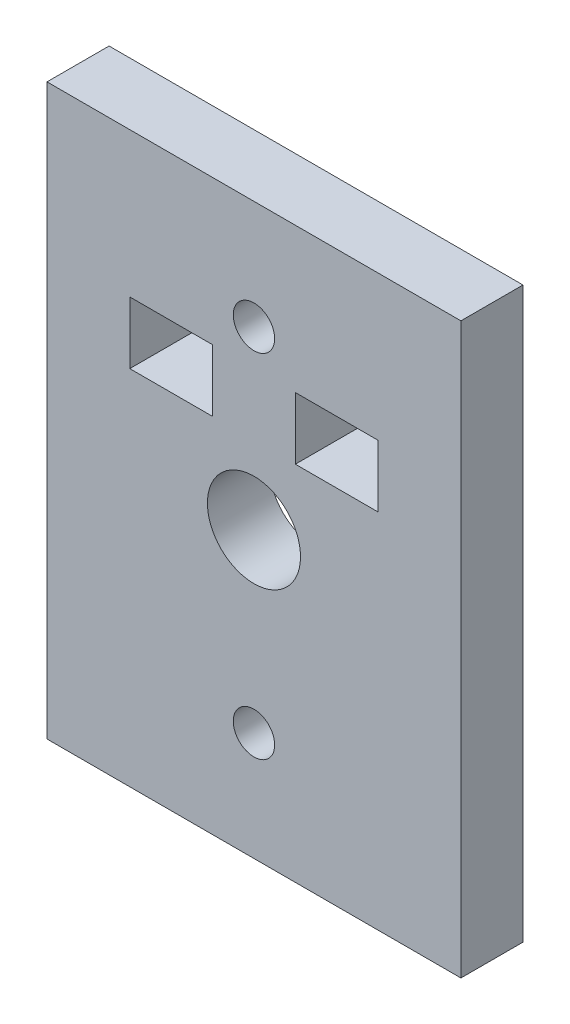
ISO-10303-21;
HEADER;
FILE_DESCRIPTION(('STEP AP214'),'2;1');
FILE_NAME('part.step','',(''),(''),'','','');
FILE_SCHEMA(('AUTOMOTIVE_DESIGN { 1 0 10303 214 1 1 1 1 }'));
ENDSEC;
DATA;
#1=APPLICATION_CONTEXT('core data for automotive mechanical design processes');
#2=APPLICATION_PROTOCOL_DEFINITION('international standard','automotive_design',2000,#1);
#3=PRODUCT_CONTEXT('',#1,'mechanical');
#4=PRODUCT('Part','Part','',(#3));
#5=PRODUCT_RELATED_PRODUCT_CATEGORY('part','',(#4));
#6=PRODUCT_DEFINITION_FORMATION('','',#4);
#7=PRODUCT_DEFINITION_CONTEXT('part definition',#1,'design');
#8=PRODUCT_DEFINITION('design','',#6,#7);
#9=PRODUCT_DEFINITION_SHAPE('','',#8);
#10=(LENGTH_UNIT() NAMED_UNIT(*) SI_UNIT(.MILLI.,.METRE.));
#11=(NAMED_UNIT(*) PLANE_ANGLE_UNIT() SI_UNIT($,.RADIAN.));
#12=(NAMED_UNIT(*) SI_UNIT($,.STERADIAN.) SOLID_ANGLE_UNIT());
#13=UNCERTAINTY_MEASURE_WITH_UNIT(LENGTH_MEASURE(1.E-05),#10,'distance_accuracy_value','');
#14=(GEOMETRIC_REPRESENTATION_CONTEXT(3) GLOBAL_UNCERTAINTY_ASSIGNED_CONTEXT((#13)) GLOBAL_UNIT_ASSIGNED_CONTEXT((#10,
#11,#12)) REPRESENTATION_CONTEXT('',''));
#15=CARTESIAN_POINT('',(0.,0.,0.));
#16=DIRECTION('',(0.,0.,1.));
#17=DIRECTION('',(1.,0.,0.));
#18=AXIS2_PLACEMENT_3D('',#15,#16,#17);
#19=CARTESIAN_POINT('',(6.,0.,3.));
#20=DIRECTION('',(-1.,0.,0.));
#21=DIRECTION('',(0.,0.,1.));
#22=AXIS2_PLACEMENT_3D('',#19,#20,#21);
#23=PLANE('',#22);
#24=DIRECTION('',(0.,1.,0.));
#25=VECTOR('',#24,1.);
#26=CARTESIAN_POINT('',(6.,0.,0.));
#27=LINE('',#26,#25);
#28=CARTESIAN_POINT('',(6.,3.75,0.));
#29=VERTEX_POINT('',#28);
#30=CARTESIAN_POINT('',(6.,6.75,0.));
#31=VERTEX_POINT('',#30);
#32=EDGE_CURVE('E215',#29,#31,#27,.T.);
#33=ORIENTED_EDGE('',*,*,#32,.F.);
#34=DIRECTION('',(0.,0.,-1.));
#35=VECTOR('',#34,1.);
#36=CARTESIAN_POINT('',(6.,3.75,3.));
#37=LINE('',#36,#35);
#38=CARTESIAN_POINT('',(6.,3.75,3.));
#39=VERTEX_POINT('',#38);
#40=EDGE_CURVE('E11',#39,#29,#37,.T.);
#41=ORIENTED_EDGE('',*,*,#40,.F.);
#42=DIRECTION('',(0.,1.,0.));
#43=VECTOR('',#42,1.);
#44=CARTESIAN_POINT('',(6.,0.,3.));
#45=LINE('',#44,#43);
#46=CARTESIAN_POINT('',(6.,6.75,3.));
#47=VERTEX_POINT('',#46);
#48=EDGE_CURVE('E154',#39,#47,#45,.T.);
#49=ORIENTED_EDGE('',*,*,#48,.T.);
#50=DIRECTION('',(0.,0.,-1.));
#51=VECTOR('',#50,1.);
#52=CARTESIAN_POINT('',(6.,6.75,3.));
#53=LINE('',#52,#51);
#54=EDGE_CURVE('E62',#47,#31,#53,.T.);
#55=ORIENTED_EDGE('',*,*,#54,.T.);
#56=EDGE_LOOP('',(#33,#41,#49,#55));
#57=FACE_BOUND('',#56,.T.);
#58=ADVANCED_FACE('F43',(#57),#23,.T.);
#59=CARTESIAN_POINT('',(0.,3.75,3.));
#60=DIRECTION('',(0.,-1.,0.));
#61=DIRECTION('',(0.,0.,-1.));
#62=AXIS2_PLACEMENT_3D('',#59,#60,#61);
#63=PLANE('',#62);
#64=DIRECTION('',(-1.,0.,0.));
#65=VECTOR('',#64,1.);
#66=CARTESIAN_POINT('',(0.,3.75,0.));
#67=LINE('',#66,#65);
#68=CARTESIAN_POINT('',(2.,3.75,0.));
#69=VERTEX_POINT('',#68);
#70=EDGE_CURVE('E159',#29,#69,#67,.T.);
#71=ORIENTED_EDGE('',*,*,#70,.T.);
#72=DIRECTION('',(0.,0.,-1.));
#73=VECTOR('',#72,1.);
#74=CARTESIAN_POINT('',(2.,3.75,3.));
#75=LINE('',#74,#73);
#76=CARTESIAN_POINT('',(2.,3.75,3.));
#77=VERTEX_POINT('',#76);
#78=EDGE_CURVE('E53',#77,#69,#75,.T.);
#79=ORIENTED_EDGE('',*,*,#78,.F.);
#80=DIRECTION('',(-1.,0.,0.));
#81=VECTOR('',#80,1.);
#82=CARTESIAN_POINT('',(0.,3.75,3.));
#83=LINE('',#82,#81);
#84=EDGE_CURVE('E148',#39,#77,#83,.T.);
#85=ORIENTED_EDGE('',*,*,#84,.F.);
#86=ORIENTED_EDGE('',*,*,#40,.T.);
#87=EDGE_LOOP('',(#71,#79,#85,#86));
#88=FACE_BOUND('',#87,.T.);
#89=ADVANCED_FACE('F157',(#88),#63,.F.);
#90=CARTESIAN_POINT('',(2.,0.,3.));
#91=DIRECTION('',(-1.,0.,0.));
#92=DIRECTION('',(0.,0.,1.));
#93=AXIS2_PLACEMENT_3D('',#90,#91,#92);
#94=PLANE('',#93);
#95=DIRECTION('',(0.,1.,0.));
#96=VECTOR('',#95,1.);
#97=CARTESIAN_POINT('',(2.,0.,0.));
#98=LINE('',#97,#96);
#99=CARTESIAN_POINT('',(2.,6.75,0.));
#100=VERTEX_POINT('',#99);
#101=EDGE_CURVE('E218',#69,#100,#98,.T.);
#102=ORIENTED_EDGE('',*,*,#101,.T.);
#103=DIRECTION('',(0.,0.,-1.));
#104=VECTOR('',#103,1.);
#105=CARTESIAN_POINT('',(2.,6.75,3.));
#106=LINE('',#105,#104);
#107=CARTESIAN_POINT('',(2.,6.75,3.));
#108=VERTEX_POINT('',#107);
#109=EDGE_CURVE('E100',#108,#100,#106,.T.);
#110=ORIENTED_EDGE('',*,*,#109,.F.);
#111=DIRECTION('',(0.,1.,0.));
#112=VECTOR('',#111,1.);
#113=CARTESIAN_POINT('',(2.,0.,3.));
#114=LINE('',#113,#112);
#115=EDGE_CURVE('E140',#77,#108,#114,.T.);
#116=ORIENTED_EDGE('',*,*,#115,.F.);
#117=ORIENTED_EDGE('',*,*,#78,.T.);
#118=EDGE_LOOP('',(#102,#110,#116,#117));
#119=FACE_BOUND('',#118,.T.);
#120=ADVANCED_FACE('F142',(#119),#94,.F.);
#121=CARTESIAN_POINT('',(-2.,0.,3.));
#122=DIRECTION('',(-1.,0.,0.));
#123=DIRECTION('',(0.,0.,1.));
#124=AXIS2_PLACEMENT_3D('',#121,#122,#123);
#125=PLANE('',#124);
#126=DIRECTION('',(0.,1.,0.));
#127=VECTOR('',#126,1.);
#128=CARTESIAN_POINT('',(-2.,0.,0.));
#129=LINE('',#128,#127);
#130=CARTESIAN_POINT('',(-2.,3.75,0.));
#131=VERTEX_POINT('',#130);
#132=CARTESIAN_POINT('',(-2.,6.75,0.));
#133=VERTEX_POINT('',#132);
#134=EDGE_CURVE('E203',#131,#133,#129,.T.);
#135=ORIENTED_EDGE('',*,*,#134,.F.);
#136=DIRECTION('',(0.,0.,-1.));
#137=VECTOR('',#136,1.);
#138=CARTESIAN_POINT('',(-2.,3.75,3.));
#139=LINE('',#138,#137);
#140=CARTESIAN_POINT('',(-2.,3.75,3.));
#141=VERTEX_POINT('',#140);
#142=EDGE_CURVE('E171',#141,#131,#139,.T.);
#143=ORIENTED_EDGE('',*,*,#142,.F.);
#144=DIRECTION('',(0.,1.,0.));
#145=VECTOR('',#144,1.);
#146=CARTESIAN_POINT('',(-2.,0.,3.));
#147=LINE('',#146,#145);
#148=CARTESIAN_POINT('',(-2.,6.75,3.));
#149=VERTEX_POINT('',#148);
#150=EDGE_CURVE('E244',#141,#149,#147,.T.);
#151=ORIENTED_EDGE('',*,*,#150,.T.);
#152=DIRECTION('',(0.,0.,-1.));
#153=VECTOR('',#152,1.);
#154=CARTESIAN_POINT('',(-2.,6.75,3.));
#155=LINE('',#154,#153);
#156=EDGE_CURVE('E164',#149,#133,#155,.T.);
#157=ORIENTED_EDGE('',*,*,#156,.T.);
#158=EDGE_LOOP('',(#135,#143,#151,#157));
#159=FACE_BOUND('',#158,.T.);
#160=ADVANCED_FACE('F301',(#159),#125,.T.);
#161=CARTESIAN_POINT('',(0.,3.75,3.));
#162=DIRECTION('',(0.,1.,0.));
#163=DIRECTION('',(0.,0.,1.));
#164=AXIS2_PLACEMENT_3D('',#161,#162,#163);
#165=PLANE('',#164);
#166=DIRECTION('',(1.,0.,0.));
#167=VECTOR('',#166,1.);
#168=CARTESIAN_POINT('',(0.,3.75,0.));
#169=LINE('',#168,#167);
#170=CARTESIAN_POINT('',(-6.,3.75,0.));
#171=VERTEX_POINT('',#170);
#172=EDGE_CURVE('E206',#171,#131,#169,.T.);
#173=ORIENTED_EDGE('',*,*,#172,.F.);
#174=DIRECTION('',(0.,0.,-1.));
#175=VECTOR('',#174,1.);
#176=CARTESIAN_POINT('',(-6.,3.75,3.));
#177=LINE('',#176,#175);
#178=CARTESIAN_POINT('',(-6.,3.75,3.));
#179=VERTEX_POINT('',#178);
#180=EDGE_CURVE('E169',#179,#171,#177,.T.);
#181=ORIENTED_EDGE('',*,*,#180,.F.);
#182=DIRECTION('',(1.,0.,0.));
#183=VECTOR('',#182,1.);
#184=CARTESIAN_POINT('',(0.,3.75,3.));
#185=LINE('',#184,#183);
#186=EDGE_CURVE('E247',#179,#141,#185,.T.);
#187=ORIENTED_EDGE('',*,*,#186,.T.);
#188=ORIENTED_EDGE('',*,*,#142,.T.);
#189=EDGE_LOOP('',(#173,#181,#187,#188));
#190=FACE_BOUND('',#189,.T.);
#191=ADVANCED_FACE('F297',(#190),#165,.T.);
#192=CARTESIAN_POINT('',(-6.,0.,3.));
#193=DIRECTION('',(-1.,0.,0.));
#194=DIRECTION('',(0.,0.,1.));
#195=AXIS2_PLACEMENT_3D('',#192,#193,#194);
#196=PLANE('',#195);
#197=DIRECTION('',(0.,1.,0.));
#198=VECTOR('',#197,1.);
#199=CARTESIAN_POINT('',(-6.,0.,0.));
#200=LINE('',#199,#198);
#201=CARTESIAN_POINT('',(-6.,6.75,0.));
#202=VERTEX_POINT('',#201);
#203=EDGE_CURVE('E209',#171,#202,#200,.T.);
#204=ORIENTED_EDGE('',*,*,#203,.T.);
#205=DIRECTION('',(0.,0.,-1.));
#206=VECTOR('',#205,1.);
#207=CARTESIAN_POINT('',(-6.,6.75,3.));
#208=LINE('',#207,#206);
#209=CARTESIAN_POINT('',(-6.,6.75,3.));
#210=VERTEX_POINT('',#209);
#211=EDGE_CURVE('E166',#210,#202,#208,.T.);
#212=ORIENTED_EDGE('',*,*,#211,.F.);
#213=DIRECTION('',(0.,1.,0.));
#214=VECTOR('',#213,1.);
#215=CARTESIAN_POINT('',(-6.,0.,3.));
#216=LINE('',#215,#214);
#217=EDGE_CURVE('E250',#179,#210,#216,.T.);
#218=ORIENTED_EDGE('',*,*,#217,.F.);
#219=ORIENTED_EDGE('',*,*,#180,.T.);
#220=EDGE_LOOP('',(#204,#212,#218,#219));
#221=FACE_BOUND('',#220,.T.);
#222=ADVANCED_FACE('F294',(#221),#196,.F.);
#223=CARTESIAN_POINT('',(0.,-13.75,3.));
#224=DIRECTION('',(0.,1.,0.));
#225=DIRECTION('',(-1.,0.,0.));
#226=AXIS2_PLACEMENT_3D('',#223,#224,#225);
#227=PLANE('',#226);
#228=DIRECTION('',(1.,0.,0.));
#229=VECTOR('',#228,1.);
#230=CARTESIAN_POINT('',(0.,-13.75,0.));
#231=LINE('',#230,#229);
#232=CARTESIAN_POINT('',(-10.,-13.75,0.));
#233=VERTEX_POINT('',#232);
#234=CARTESIAN_POINT('',(10.,-13.75,0.));
#235=VERTEX_POINT('',#234);
#236=EDGE_CURVE('E190',#233,#235,#231,.T.);
#237=ORIENTED_EDGE('',*,*,#236,.T.);
#238=DIRECTION('',(0.,0.,-1.));
#239=VECTOR('',#238,1.);
#240=CARTESIAN_POINT('',(10.,-13.75,3.));
#241=LINE('',#240,#239);
#242=CARTESIAN_POINT('',(10.,-13.75,3.));
#243=VERTEX_POINT('',#242);
#244=EDGE_CURVE('E47',#243,#235,#241,.T.);
#245=ORIENTED_EDGE('',*,*,#244,.F.);
#246=DIRECTION('',(1.,0.,0.));
#247=VECTOR('',#246,1.);
#248=CARTESIAN_POINT('',(0.,-13.75,3.));
#249=LINE('',#248,#247);
#250=CARTESIAN_POINT('',(-10.,-13.75,3.));
#251=VERTEX_POINT('',#250);
#252=EDGE_CURVE('E231',#251,#243,#249,.T.);
#253=ORIENTED_EDGE('',*,*,#252,.F.);
#254=DIRECTION('',(0.,0.,-1.));
#255=VECTOR('',#254,1.);
#256=CARTESIAN_POINT('',(-10.,-13.75,3.));
#257=LINE('',#256,#255);
#258=EDGE_CURVE('E173',#251,#233,#257,.T.);
#259=ORIENTED_EDGE('',*,*,#258,.T.);
#260=EDGE_LOOP('',(#237,#245,#253,#259));
#261=FACE_BOUND('',#260,.T.);
#262=ADVANCED_FACE('F45',(#261),#227,.F.);
#263=CARTESIAN_POINT('',(10.,0.,3.));
#264=DIRECTION('',(-1.,0.,0.));
#265=DIRECTION('',(0.,0.,1.));
#266=AXIS2_PLACEMENT_3D('',#263,#264,#265);
#267=PLANE('',#266);
#268=DIRECTION('',(0.,1.,0.));
#269=VECTOR('',#268,1.);
#270=CARTESIAN_POINT('',(10.,0.,0.));
#271=LINE('',#270,#269);
#272=CARTESIAN_POINT('',(10.,13.75,0.));
#273=VERTEX_POINT('',#272);
#274=EDGE_CURVE('E185',#235,#273,#271,.T.);
#275=ORIENTED_EDGE('',*,*,#274,.T.);
#276=DIRECTION('',(0.,0.,-1.));
#277=VECTOR('',#276,1.);
#278=CARTESIAN_POINT('',(10.,13.75,3.));
#279=LINE('',#278,#277);
#280=CARTESIAN_POINT('',(10.,13.75,3.));
#281=VERTEX_POINT('',#280);
#282=EDGE_CURVE('E177',#281,#273,#279,.T.);
#283=ORIENTED_EDGE('',*,*,#282,.F.);
#284=DIRECTION('',(0.,1.,0.));
#285=VECTOR('',#284,1.);
#286=CARTESIAN_POINT('',(10.,0.,3.));
#287=LINE('',#286,#285);
#288=EDGE_CURVE('E113',#243,#281,#287,.T.);
#289=ORIENTED_EDGE('',*,*,#288,.F.);
#290=ORIENTED_EDGE('',*,*,#244,.T.);
#291=EDGE_LOOP('',(#275,#283,#289,#290));
#292=FACE_BOUND('',#291,.T.);
#293=ADVANCED_FACE('F184',(#292),#267,.F.);
#294=CARTESIAN_POINT('',(0.,13.75,3.));
#295=DIRECTION('',(0.,1.,0.));
#296=DIRECTION('',(0.,0.,1.));
#297=AXIS2_PLACEMENT_3D('',#294,#295,#296);
#298=PLANE('',#297);
#299=DIRECTION('',(1.,0.,0.));
#300=VECTOR('',#299,1.);
#301=CARTESIAN_POINT('',(0.,13.75,0.));
#302=LINE('',#301,#300);
#303=CARTESIAN_POINT('',(-10.,13.75,0.));
#304=VERTEX_POINT('',#303);
#305=EDGE_CURVE('E195',#304,#273,#302,.T.);
#306=ORIENTED_EDGE('',*,*,#305,.F.);
#307=DIRECTION('',(0.,0.,-1.));
#308=VECTOR('',#307,1.);
#309=CARTESIAN_POINT('',(-10.,13.75,3.));
#310=LINE('',#309,#308);
#311=CARTESIAN_POINT('',(-10.,13.75,3.));
#312=VERTEX_POINT('',#311);
#313=EDGE_CURVE('E175',#312,#304,#310,.T.);
#314=ORIENTED_EDGE('',*,*,#313,.F.);
#315=DIRECTION('',(1.,0.,0.));
#316=VECTOR('',#315,1.);
#317=CARTESIAN_POINT('',(0.,13.75,3.));
#318=LINE('',#317,#316);
#319=EDGE_CURVE('E237',#312,#281,#318,.T.);
#320=ORIENTED_EDGE('',*,*,#319,.T.);
#321=ORIENTED_EDGE('',*,*,#282,.T.);
#322=EDGE_LOOP('',(#306,#314,#320,#321));
#323=FACE_BOUND('',#322,.T.);
#324=ADVANCED_FACE('F306',(#323),#298,.T.);
#325=CARTESIAN_POINT('',(0.,8.5,3.));
#326=DIRECTION('',(0.,0.,-1.));
#327=DIRECTION('',(-1.,0.,0.));
#328=AXIS2_PLACEMENT_3D('',#325,#326,#327);
#329=CYLINDRICAL_SURFACE('',#328,1.);
#330=CARTESIAN_POINT('',(0.,8.5,3.));
#331=DIRECTION('',(0.,0.,1.));
#332=DIRECTION('',(1.,0.,0.));
#333=AXIS2_PLACEMENT_3D('',#330,#331,#332);
#334=CIRCLE('',#333,1.);
#335=CARTESIAN_POINT('',(1.,8.5,3.));
#336=VERTEX_POINT('',#335);
#337=EDGE_CURVE('E259',#336,#336,#334,.T.);
#338=ORIENTED_EDGE('',*,*,#337,.T.);
#339=EDGE_LOOP('',(#338));
#340=FACE_BOUND('',#339,.T.);
#341=CARTESIAN_POINT('',(0.,8.5,0.));
#342=DIRECTION('',(0.,0.,1.));
#343=DIRECTION('',(1.,0.,0.));
#344=AXIS2_PLACEMENT_3D('',#341,#342,#343);
#345=CIRCLE('',#344,1.);
#346=CARTESIAN_POINT('',(1.,8.5,0.));
#347=VERTEX_POINT('',#346);
#348=EDGE_CURVE('E226',#347,#347,#345,.T.);
#349=ORIENTED_EDGE('',*,*,#348,.F.);
#350=EDGE_LOOP('',(#349));
#351=FACE_BOUND('',#350,.T.);
#352=ADVANCED_FACE('F308',(#340,#351),#329,.F.);
#353=CARTESIAN_POINT('',(0.,0.,3.));
#354=DIRECTION('',(0.,0.,-1.));
#355=DIRECTION('',(-1.,0.,0.));
#356=AXIS2_PLACEMENT_3D('',#353,#354,#355);
#357=CYLINDRICAL_SURFACE('',#356,2.25);
#358=CARTESIAN_POINT('',(0.,0.,3.));
#359=DIRECTION('',(0.,0.,1.));
#360=DIRECTION('',(1.,0.,0.));
#361=AXIS2_PLACEMENT_3D('',#358,#359,#360);
#362=CIRCLE('',#361,2.25);
#363=CARTESIAN_POINT('',(2.25,0.,3.));
#364=VERTEX_POINT('',#363);
#365=EDGE_CURVE('E257',#364,#364,#362,.T.);
#366=ORIENTED_EDGE('',*,*,#365,.T.);
#367=EDGE_LOOP('',(#366));
#368=FACE_BOUND('',#367,.T.);
#369=CARTESIAN_POINT('',(0.,0.,0.));
#370=DIRECTION('',(0.,0.,1.));
#371=DIRECTION('',(1.,0.,0.));
#372=AXIS2_PLACEMENT_3D('',#369,#370,#371);
#373=CIRCLE('',#372,2.25);
#374=CARTESIAN_POINT('',(2.25,0.,0.));
#375=VERTEX_POINT('',#374);
#376=EDGE_CURVE('E223',#375,#375,#373,.T.);
#377=ORIENTED_EDGE('',*,*,#376,.F.);
#378=EDGE_LOOP('',(#377));
#379=FACE_BOUND('',#378,.T.);
#380=ADVANCED_FACE('F384',(#368,#379),#357,.F.);
#381=CARTESIAN_POINT('',(0.,6.75,3.));
#382=DIRECTION('',(0.,-1.,0.));
#383=DIRECTION('',(0.,0.,-1.));
#384=AXIS2_PLACEMENT_3D('',#381,#382,#383);
#385=PLANE('',#384);
#386=DIRECTION('',(-1.,0.,0.));
#387=VECTOR('',#386,1.);
#388=CARTESIAN_POINT('',(0.,6.75,0.));
#389=LINE('',#388,#387);
#390=EDGE_CURVE('E220',#31,#100,#389,.T.);
#391=ORIENTED_EDGE('',*,*,#390,.F.);
#392=ORIENTED_EDGE('',*,*,#54,.F.);
#393=DIRECTION('',(-1.,0.,0.));
#394=VECTOR('',#393,1.);
#395=CARTESIAN_POINT('',(0.,6.75,3.));
#396=LINE('',#395,#394);
#397=EDGE_CURVE('E147',#47,#108,#396,.T.);
#398=ORIENTED_EDGE('',*,*,#397,.T.);
#399=ORIENTED_EDGE('',*,*,#109,.T.);
#400=EDGE_LOOP('',(#391,#392,#398,#399));
#401=FACE_BOUND('',#400,.T.);
#402=ADVANCED_FACE('F292',(#401),#385,.T.);
#403=CARTESIAN_POINT('',(0.,6.75,3.));
#404=DIRECTION('',(0.,1.,0.));
#405=DIRECTION('',(0.,0.,1.));
#406=AXIS2_PLACEMENT_3D('',#403,#404,#405);
#407=PLANE('',#406);
#408=DIRECTION('',(1.,0.,0.));
#409=VECTOR('',#408,1.);
#410=CARTESIAN_POINT('',(0.,6.75,0.));
#411=LINE('',#410,#409);
#412=EDGE_CURVE('E212',#202,#133,#411,.T.);
#413=ORIENTED_EDGE('',*,*,#412,.T.);
#414=ORIENTED_EDGE('',*,*,#156,.F.);
#415=DIRECTION('',(1.,0.,0.));
#416=VECTOR('',#415,1.);
#417=CARTESIAN_POINT('',(0.,6.75,3.));
#418=LINE('',#417,#416);
#419=EDGE_CURVE('E253',#210,#149,#418,.T.);
#420=ORIENTED_EDGE('',*,*,#419,.F.);
#421=ORIENTED_EDGE('',*,*,#211,.T.);
#422=EDGE_LOOP('',(#413,#414,#420,#421));
#423=FACE_BOUND('',#422,.T.);
#424=ADVANCED_FACE('F277',(#423),#407,.F.);
#425=CARTESIAN_POINT('',(-10.,0.,3.));
#426=DIRECTION('',(-1.,0.,0.));
#427=DIRECTION('',(0.,-1.,0.));
#428=AXIS2_PLACEMENT_3D('',#425,#426,#427);
#429=PLANE('',#428);
#430=DIRECTION('',(0.,1.,0.));
#431=VECTOR('',#430,1.);
#432=CARTESIAN_POINT('',(-10.,0.,0.));
#433=LINE('',#432,#431);
#434=EDGE_CURVE('E201',#233,#304,#433,.T.);
#435=ORIENTED_EDGE('',*,*,#434,.F.);
#436=ORIENTED_EDGE('',*,*,#258,.F.);
#437=DIRECTION('',(0.,1.,0.));
#438=VECTOR('',#437,1.);
#439=CARTESIAN_POINT('',(-10.,0.,3.));
#440=LINE('',#439,#438);
#441=EDGE_CURVE('E241',#251,#312,#440,.T.);
#442=ORIENTED_EDGE('',*,*,#441,.T.);
#443=ORIENTED_EDGE('',*,*,#313,.T.);
#444=EDGE_LOOP('',(#435,#436,#442,#443));
#445=FACE_BOUND('',#444,.T.);
#446=ADVANCED_FACE('F269',(#445),#429,.T.);
#447=CARTESIAN_POINT('',(0.,-8.5,3.));
#448=DIRECTION('',(0.,0.,-1.));
#449=DIRECTION('',(-1.,0.,0.));
#450=AXIS2_PLACEMENT_3D('',#447,#448,#449);
#451=CYLINDRICAL_SURFACE('',#450,1.);
#452=CARTESIAN_POINT('',(0.,-8.5,3.));
#453=DIRECTION('',(0.,0.,1.));
#454=DIRECTION('',(1.,0.,0.));
#455=AXIS2_PLACEMENT_3D('',#452,#453,#454);
#456=CIRCLE('',#455,1.);
#457=CARTESIAN_POINT('',(1.,-8.5,3.));
#458=VERTEX_POINT('',#457);
#459=EDGE_CURVE('E176',#458,#458,#456,.F.);
#460=ORIENTED_EDGE('',*,*,#459,.F.);
#461=EDGE_LOOP('',(#460));
#462=FACE_BOUND('',#461,.T.);
#463=CARTESIAN_POINT('',(0.,-8.5,0.));
#464=DIRECTION('',(0.,0.,1.));
#465=DIRECTION('',(1.,0.,0.));
#466=AXIS2_PLACEMENT_3D('',#463,#464,#465);
#467=CIRCLE('',#466,1.);
#468=CARTESIAN_POINT('',(1.,-8.5,0.));
#469=VERTEX_POINT('',#468);
#470=EDGE_CURVE('E229',#469,#469,#467,.F.);
#471=ORIENTED_EDGE('',*,*,#470,.T.);
#472=EDGE_LOOP('',(#471));
#473=FACE_BOUND('',#472,.T.);
#474=ADVANCED_FACE('F267',(#462,#473),#451,.F.);
#475=CARTESIAN_POINT('',(0.,0.,3.));
#476=DIRECTION('',(0.,0.,1.));
#477=DIRECTION('',(1.,0.,0.));
#478=AXIS2_PLACEMENT_3D('',#475,#476,#477);
#479=PLANE('',#478);
#480=ORIENTED_EDGE('',*,*,#252,.T.);
#481=ORIENTED_EDGE('',*,*,#288,.T.);
#482=ORIENTED_EDGE('',*,*,#319,.F.);
#483=ORIENTED_EDGE('',*,*,#441,.F.);
#484=EDGE_LOOP('',(#480,#481,#482,#483));
#485=FACE_BOUND('',#484,.T.);
#486=ORIENTED_EDGE('',*,*,#150,.F.);
#487=ORIENTED_EDGE('',*,*,#186,.F.);
#488=ORIENTED_EDGE('',*,*,#217,.T.);
#489=ORIENTED_EDGE('',*,*,#419,.T.);
#490=EDGE_LOOP('',(#486,#487,#488,#489));
#491=FACE_BOUND('',#490,.T.);
#492=ORIENTED_EDGE('',*,*,#48,.F.);
#493=ORIENTED_EDGE('',*,*,#84,.T.);
#494=ORIENTED_EDGE('',*,*,#115,.T.);
#495=ORIENTED_EDGE('',*,*,#397,.F.);
#496=EDGE_LOOP('',(#492,#493,#494,#495));
#497=FACE_BOUND('',#496,.T.);
#498=ORIENTED_EDGE('',*,*,#365,.F.);
#499=EDGE_LOOP('',(#498));
#500=FACE_BOUND('',#499,.T.);
#501=ORIENTED_EDGE('',*,*,#337,.F.);
#502=EDGE_LOOP('',(#501));
#503=FACE_BOUND('',#502,.T.);
#504=ORIENTED_EDGE('',*,*,#459,.T.);
#505=EDGE_LOOP('',(#504));
#506=FACE_BOUND('',#505,.T.);
#507=ADVANCED_FACE('F152',(#485,#491,#497,#500,#503,#506),#479,.T.);
#508=CARTESIAN_POINT('',(0.,0.,0.));
#509=DIRECTION('',(0.,0.,1.));
#510=DIRECTION('',(1.,0.,0.));
#511=AXIS2_PLACEMENT_3D('',#508,#509,#510);
#512=PLANE('',#511);
#513=ORIENTED_EDGE('',*,*,#236,.F.);
#514=ORIENTED_EDGE('',*,*,#434,.T.);
#515=ORIENTED_EDGE('',*,*,#305,.T.);
#516=ORIENTED_EDGE('',*,*,#274,.F.);
#517=EDGE_LOOP('',(#513,#514,#515,#516));
#518=FACE_BOUND('',#517,.T.);
#519=ORIENTED_EDGE('',*,*,#134,.T.);
#520=ORIENTED_EDGE('',*,*,#412,.F.);
#521=ORIENTED_EDGE('',*,*,#203,.F.);
#522=ORIENTED_EDGE('',*,*,#172,.T.);
#523=EDGE_LOOP('',(#519,#520,#521,#522));
#524=FACE_BOUND('',#523,.T.);
#525=ORIENTED_EDGE('',*,*,#32,.T.);
#526=ORIENTED_EDGE('',*,*,#390,.T.);
#527=ORIENTED_EDGE('',*,*,#101,.F.);
#528=ORIENTED_EDGE('',*,*,#70,.F.);
#529=EDGE_LOOP('',(#525,#526,#527,#528));
#530=FACE_BOUND('',#529,.T.);
#531=ORIENTED_EDGE('',*,*,#376,.T.);
#532=EDGE_LOOP('',(#531));
#533=FACE_BOUND('',#532,.T.);
#534=ORIENTED_EDGE('',*,*,#348,.T.);
#535=EDGE_LOOP('',(#534));
#536=FACE_BOUND('',#535,.T.);
#537=ORIENTED_EDGE('',*,*,#470,.F.);
#538=EDGE_LOOP('',(#537));
#539=FACE_BOUND('',#538,.T.);
#540=ADVANCED_FACE('F275',(#518,#524,#530,#533,#536,#539),#512,.F.);
#541=CLOSED_SHELL('',(#58,#89,#120,#160,#191,#222,#262,#293,#324,#352,#380,#402,#424,#446,#474,
#507,#540));
#542=MANIFOLD_SOLID_BREP('B2',#541);
#543=ADVANCED_BREP_SHAPE_REPRESENTATION('',(#18,#542),#14);
#544=SHAPE_DEFINITION_REPRESENTATION(#9,#543);
ENDSEC;
END-ISO-10303-21;
